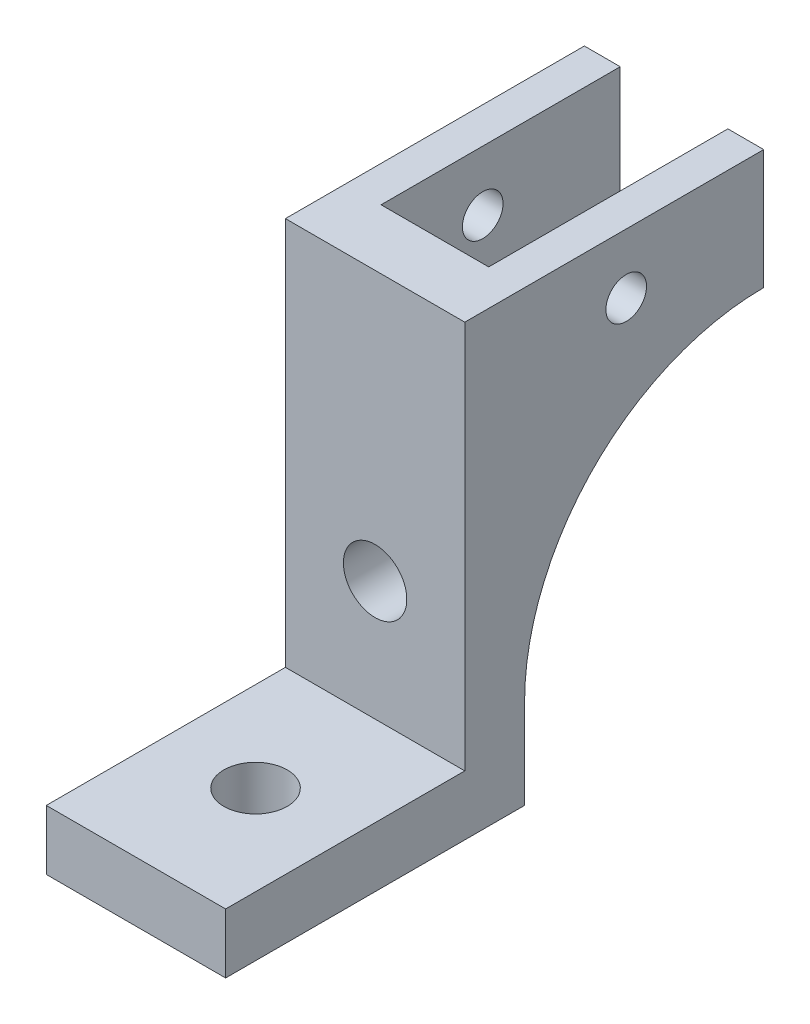
ISO-10303-21;
HEADER;
FILE_DESCRIPTION(('STEP AP214'),'2;1');
FILE_NAME('part.step','',(''),(''),'','','');
FILE_SCHEMA(('AUTOMOTIVE_DESIGN { 1 0 10303 214 1 1 1 1 }'));
ENDSEC;
DATA;
#1=APPLICATION_CONTEXT('core data for automotive mechanical design processes');
#2=APPLICATION_PROTOCOL_DEFINITION('international standard','automotive_design',2000,#1);
#3=PRODUCT_CONTEXT('',#1,'mechanical');
#4=PRODUCT('Part','Part','',(#3));
#5=PRODUCT_RELATED_PRODUCT_CATEGORY('part','',(#4));
#6=PRODUCT_DEFINITION_FORMATION('','',#4);
#7=PRODUCT_DEFINITION_CONTEXT('part definition',#1,'design');
#8=PRODUCT_DEFINITION('design','',#6,#7);
#9=PRODUCT_DEFINITION_SHAPE('','',#8);
#10=(LENGTH_UNIT() NAMED_UNIT(*) SI_UNIT(.MILLI.,.METRE.));
#11=(NAMED_UNIT(*) PLANE_ANGLE_UNIT() SI_UNIT($,.RADIAN.));
#12=(NAMED_UNIT(*) SI_UNIT($,.STERADIAN.) SOLID_ANGLE_UNIT());
#13=UNCERTAINTY_MEASURE_WITH_UNIT(LENGTH_MEASURE(1.E-05),#10,'distance_accuracy_value','');
#14=(GEOMETRIC_REPRESENTATION_CONTEXT(3) GLOBAL_UNCERTAINTY_ASSIGNED_CONTEXT((#13)) GLOBAL_UNIT_ASSIGNED_CONTEXT((#10,
#11,#12)) REPRESENTATION_CONTEXT('',''));
#15=CARTESIAN_POINT('',(0.,0.,0.));
#16=DIRECTION('',(0.,0.,1.));
#17=DIRECTION('',(1.,0.,0.));
#18=AXIS2_PLACEMENT_3D('',#15,#16,#17);
#19=CARTESIAN_POINT('',(0.,0.,0.));
#20=DIRECTION('',(0.,0.,-1.));
#21=DIRECTION('',(-1.,0.,0.));
#22=AXIS2_PLACEMENT_3D('',#19,#20,#21);
#23=PLANE('',#22);
#24=CARTESIAN_POINT('',(7.5,15.,0.));
#25=DIRECTION('',(0.,0.,-1.));
#26=DIRECTION('',(-1.,0.,0.));
#27=AXIS2_PLACEMENT_3D('',#24,#25,#26);
#28=CIRCLE('',#27,2.65);
#29=CARTESIAN_POINT('',(4.85,15.,0.));
#30=VERTEX_POINT('',#29);
#31=EDGE_CURVE('E283',#30,#30,#28,.T.);
#32=ORIENTED_EDGE('',*,*,#31,.F.);
#33=EDGE_LOOP('',(#32));
#34=FACE_BOUND('',#33,.T.);
#35=DIRECTION('',(0.,-1.,0.));
#36=VECTOR('',#35,1.);
#37=CARTESIAN_POINT('',(0.,0.,0.));
#38=LINE('',#37,#36);
#39=CARTESIAN_POINT('',(0.,7.5,0.));
#40=VERTEX_POINT('',#39);
#41=CARTESIAN_POINT('',(0.,0.,0.));
#42=VERTEX_POINT('',#41);
#43=EDGE_CURVE('E218',#40,#42,#38,.T.);
#44=ORIENTED_EDGE('',*,*,#43,.F.);
#45=DIRECTION('',(-1.,0.,0.));
#46=VECTOR('',#45,1.);
#47=CARTESIAN_POINT('',(0.,7.5,0.));
#48=LINE('',#47,#46);
#49=CARTESIAN_POINT('',(2.99999999999999,7.5,0.));
#50=VERTEX_POINT('',#49);
#51=EDGE_CURVE('E257',#40,#50,#48,.F.);
#52=ORIENTED_EDGE('',*,*,#51,.T.);
#53=DIRECTION('',(0.,-1.,0.));
#54=VECTOR('',#53,1.);
#55=CARTESIAN_POINT('',(2.99999999999999,37.5,0.));
#56=LINE('',#55,#54);
#57=CARTESIAN_POINT('',(2.99999999999999,37.5,0.));
#58=VERTEX_POINT('',#57);
#59=EDGE_CURVE('E56',#58,#50,#56,.T.);
#60=ORIENTED_EDGE('',*,*,#59,.F.);
#61=DIRECTION('',(-1.,0.,0.));
#62=VECTOR('',#61,1.);
#63=CARTESIAN_POINT('',(0.,37.5,0.));
#64=LINE('',#63,#62);
#65=CARTESIAN_POINT('',(12.,37.5,0.));
#66=VERTEX_POINT('',#65);
#67=EDGE_CURVE('E222',#66,#58,#64,.T.);
#68=ORIENTED_EDGE('',*,*,#67,.F.);
#69=DIRECTION('',(0.,1.,0.));
#70=VECTOR('',#69,1.);
#71=CARTESIAN_POINT('',(12.,37.5,0.));
#72=LINE('',#71,#70);
#73=CARTESIAN_POINT('',(12.,7.5,0.));
#74=VERTEX_POINT('',#73);
#75=EDGE_CURVE('E64',#74,#66,#72,.T.);
#76=ORIENTED_EDGE('',*,*,#75,.F.);
#77=DIRECTION('',(-1.,0.,0.));
#78=VECTOR('',#77,1.);
#79=CARTESIAN_POINT('',(0.,7.5,0.));
#80=LINE('',#79,#78);
#81=CARTESIAN_POINT('',(15.,7.5,0.));
#82=VERTEX_POINT('',#81);
#83=EDGE_CURVE('E248',#74,#82,#80,.F.);
#84=ORIENTED_EDGE('',*,*,#83,.T.);
#85=DIRECTION('',(0.,1.,0.));
#86=VECTOR('',#85,1.);
#87=CARTESIAN_POINT('',(15.,0.,0.));
#88=LINE('',#87,#86);
#89=CARTESIAN_POINT('',(15.,0.,0.));
#90=VERTEX_POINT('',#89);
#91=EDGE_CURVE('E232',#90,#82,#88,.T.);
#92=ORIENTED_EDGE('',*,*,#91,.F.);
#93=DIRECTION('',(1.,0.,0.));
#94=VECTOR('',#93,1.);
#95=CARTESIAN_POINT('',(0.,0.,0.));
#96=LINE('',#95,#94);
#97=EDGE_CURVE('E229',#42,#90,#96,.T.);
#98=ORIENTED_EDGE('',*,*,#97,.F.);
#99=EDGE_LOOP('',(#44,#52,#60,#68,#76,#84,#92,#98));
#100=FACE_BOUND('',#99,.T.);
#101=ADVANCED_FACE('F38',(#34,#100),#23,.T.);
#102=CARTESIAN_POINT('',(0.,0.,5.));
#103=DIRECTION('',(0.,0.,-1.));
#104=DIRECTION('',(-1.,0.,0.));
#105=AXIS2_PLACEMENT_3D('',#102,#103,#104);
#106=PLANE('',#105);
#107=CARTESIAN_POINT('',(7.5,15.,5.));
#108=DIRECTION('',(0.,0.,-1.));
#109=DIRECTION('',(-1.,0.,0.));
#110=AXIS2_PLACEMENT_3D('',#107,#108,#109);
#111=CIRCLE('',#110,2.65);
#112=CARTESIAN_POINT('',(4.85,15.,5.));
#113=VERTEX_POINT('',#112);
#114=EDGE_CURVE('E42',#113,#113,#111,.T.);
#115=ORIENTED_EDGE('',*,*,#114,.T.);
#116=EDGE_LOOP('',(#115));
#117=FACE_BOUND('',#116,.T.);
#118=DIRECTION('',(-1.,0.,0.));
#119=VECTOR('',#118,1.);
#120=CARTESIAN_POINT('',(0.,5.,5.));
#121=LINE('',#120,#119);
#122=CARTESIAN_POINT('',(15.,5.,5.));
#123=VERTEX_POINT('',#122);
#124=CARTESIAN_POINT('',(0.,5.,5.));
#125=VERTEX_POINT('',#124);
#126=EDGE_CURVE('E193',#123,#125,#121,.T.);
#127=ORIENTED_EDGE('',*,*,#126,.F.);
#128=DIRECTION('',(0.,1.,0.));
#129=VECTOR('',#128,1.);
#130=CARTESIAN_POINT('',(15.,0.,5.));
#131=LINE('',#130,#129);
#132=CARTESIAN_POINT('',(15.,37.5,5.));
#133=VERTEX_POINT('',#132);
#134=EDGE_CURVE('E221',#123,#133,#131,.T.);
#135=ORIENTED_EDGE('',*,*,#134,.T.);
#136=DIRECTION('',(-1.,0.,0.));
#137=VECTOR('',#136,1.);
#138=CARTESIAN_POINT('',(0.,37.5,5.));
#139=LINE('',#138,#137);
#140=CARTESIAN_POINT('',(0.,37.5,5.));
#141=VERTEX_POINT('',#140);
#142=EDGE_CURVE('E141',#133,#141,#139,.T.);
#143=ORIENTED_EDGE('',*,*,#142,.T.);
#144=DIRECTION('',(0.,-1.,0.));
#145=VECTOR('',#144,1.);
#146=CARTESIAN_POINT('',(0.,0.,5.));
#147=LINE('',#146,#145);
#148=EDGE_CURVE('E136',#141,#125,#147,.T.);
#149=ORIENTED_EDGE('',*,*,#148,.T.);
#150=EDGE_LOOP('',(#127,#135,#143,#149));
#151=FACE_BOUND('',#150,.T.);
#152=ADVANCED_FACE('F311',(#117,#151),#106,.F.);
#153=CARTESIAN_POINT('',(0.,0.,5.));
#154=DIRECTION('',(1.,0.,0.));
#155=DIRECTION('',(0.,1.,0.));
#156=AXIS2_PLACEMENT_3D('',#153,#154,#155);
#157=PLANE('',#156);
#158=CARTESIAN_POINT('',(0.,32.5000000000029,-8.49999999999806));
#159=DIRECTION('',(1.,0.,0.));
#160=DIRECTION('',(0.,1.,0.));
#161=AXIS2_PLACEMENT_3D('',#158,#159,#160);
#162=CIRCLE('',#161,1.7);
#163=CARTESIAN_POINT('',(0.,34.2000000000029,-8.49999999999806));
#164=VERTEX_POINT('',#163);
#165=EDGE_CURVE('E254',#164,#164,#162,.T.);
#166=ORIENTED_EDGE('',*,*,#165,.T.);
#167=EDGE_LOOP('',(#166));
#168=FACE_BOUND('',#167,.T.);
#169=DIRECTION('',(0.,0.,-1.));
#170=VECTOR('',#169,1.);
#171=CARTESIAN_POINT('',(0.,37.5,5.));
#172=LINE('',#171,#170);
#173=CARTESIAN_POINT('',(0.,37.5,-20.));
#174=VERTEX_POINT('',#173);
#175=EDGE_CURVE('E130',#141,#174,#172,.T.);
#176=ORIENTED_EDGE('',*,*,#175,.T.);
#177=DIRECTION('',(0.,1.,0.));
#178=VECTOR('',#177,1.);
#179=CARTESIAN_POINT('',(0.,37.5,-20.));
#180=LINE('',#179,#178);
#181=CARTESIAN_POINT('',(0.,27.5,-20.));
#182=VERTEX_POINT('',#181);
#183=EDGE_CURVE('E134',#182,#174,#180,.T.);
#184=ORIENTED_EDGE('',*,*,#183,.F.);
#185=CARTESIAN_POINT('',(0.,7.5,-20.));
#186=DIRECTION('',(1.,0.,0.));
#187=DIRECTION('',(0.,1.,0.));
#188=AXIS2_PLACEMENT_3D('',#185,#186,#187);
#189=CIRCLE('',#188,20.);
#190=EDGE_CURVE('E260',#182,#40,#189,.T.);
#191=ORIENTED_EDGE('',*,*,#190,.T.);
#192=ORIENTED_EDGE('',*,*,#43,.T.);
#193=DIRECTION('',(0.,0.,-1.));
#194=VECTOR('',#193,1.);
#195=CARTESIAN_POINT('',(0.,0.,5.));
#196=LINE('',#195,#194);
#197=CARTESIAN_POINT('',(0.,0.,25.));
#198=VERTEX_POINT('',#197);
#199=EDGE_CURVE('E244',#198,#42,#196,.T.);
#200=ORIENTED_EDGE('',*,*,#199,.F.);
#201=DIRECTION('',(0.,-1.,0.));
#202=VECTOR('',#201,1.);
#203=CARTESIAN_POINT('',(0.,0.,25.));
#204=LINE('',#203,#202);
#205=CARTESIAN_POINT('',(0.,5.,25.));
#206=VERTEX_POINT('',#205);
#207=EDGE_CURVE('E194',#206,#198,#204,.T.);
#208=ORIENTED_EDGE('',*,*,#207,.F.);
#209=DIRECTION('',(0.,0.,-1.));
#210=VECTOR('',#209,1.);
#211=CARTESIAN_POINT('',(0.,5.,25.));
#212=LINE('',#211,#210);
#213=EDGE_CURVE('E208',#206,#125,#212,.T.);
#214=ORIENTED_EDGE('',*,*,#213,.T.);
#215=ORIENTED_EDGE('',*,*,#148,.F.);
#216=EDGE_LOOP('',(#176,#184,#191,#192,#200,#208,#214,#215));
#217=FACE_BOUND('',#216,.T.);
#218=ADVANCED_FACE('F132',(#168,#217),#157,.F.);
#219=CARTESIAN_POINT('',(0.,0.,5.));
#220=DIRECTION('',(0.,1.,0.));
#221=DIRECTION('',(0.,0.,1.));
#222=AXIS2_PLACEMENT_3D('',#219,#220,#221);
#223=PLANE('',#222);
#224=CARTESIAN_POINT('',(7.5,0.,15.));
#225=DIRECTION('',(0.,-1.,0.));
#226=DIRECTION('',(0.,0.,-1.));
#227=AXIS2_PLACEMENT_3D('',#224,#225,#226);
#228=CIRCLE('',#227,2.65);
#229=CARTESIAN_POINT('',(7.5,0.,12.35));
#230=VERTEX_POINT('',#229);
#231=EDGE_CURVE('E270',#230,#230,#228,.T.);
#232=ORIENTED_EDGE('',*,*,#231,.F.);
#233=EDGE_LOOP('',(#232));
#234=FACE_BOUND('',#233,.T.);
#235=ORIENTED_EDGE('',*,*,#97,.T.);
#236=DIRECTION('',(0.,0.,-1.));
#237=VECTOR('',#236,1.);
#238=CARTESIAN_POINT('',(15.,0.,5.));
#239=LINE('',#238,#237);
#240=CARTESIAN_POINT('',(15.,0.,25.));
#241=VERTEX_POINT('',#240);
#242=EDGE_CURVE('E240',#241,#90,#239,.T.);
#243=ORIENTED_EDGE('',*,*,#242,.F.);
#244=DIRECTION('',(1.,0.,0.));
#245=VECTOR('',#244,1.);
#246=CARTESIAN_POINT('',(0.,0.,25.));
#247=LINE('',#246,#245);
#248=EDGE_CURVE('E198',#198,#241,#247,.T.);
#249=ORIENTED_EDGE('',*,*,#248,.F.);
#250=ORIENTED_EDGE('',*,*,#199,.T.);
#251=EDGE_LOOP('',(#235,#243,#249,#250));
#252=FACE_BOUND('',#251,.T.);
#253=ADVANCED_FACE('F328',(#234,#252),#223,.F.);
#254=CARTESIAN_POINT('',(15.,0.,5.));
#255=DIRECTION('',(-1.,0.,0.));
#256=DIRECTION('',(0.,-1.,0.));
#257=AXIS2_PLACEMENT_3D('',#254,#255,#256);
#258=PLANE('',#257);
#259=CARTESIAN_POINT('',(15.,32.5000000000029,-8.49999999999806));
#260=DIRECTION('',(-1.,0.,0.));
#261=DIRECTION('',(0.,-1.,0.));
#262=AXIS2_PLACEMENT_3D('',#259,#260,#261);
#263=CIRCLE('',#262,1.7);
#264=CARTESIAN_POINT('',(15.,30.8000000000029,-8.49999999999806));
#265=VERTEX_POINT('',#264);
#266=EDGE_CURVE('E161',#265,#265,#263,.T.);
#267=ORIENTED_EDGE('',*,*,#266,.T.);
#268=EDGE_LOOP('',(#267));
#269=FACE_BOUND('',#268,.T.);
#270=ORIENTED_EDGE('',*,*,#91,.T.);
#271=CARTESIAN_POINT('',(15.,7.5,-20.));
#272=DIRECTION('',(-1.,0.,0.));
#273=DIRECTION('',(0.,-1.,0.));
#274=AXIS2_PLACEMENT_3D('',#271,#272,#273);
#275=CIRCLE('',#274,20.);
#276=CARTESIAN_POINT('',(15.,27.5,-20.));
#277=VERTEX_POINT('',#276);
#278=EDGE_CURVE('E11',#82,#277,#275,.T.);
#279=ORIENTED_EDGE('',*,*,#278,.T.);
#280=DIRECTION('',(0.,-1.,0.));
#281=VECTOR('',#280,1.);
#282=CARTESIAN_POINT('',(15.,37.5,-20.));
#283=LINE('',#282,#281);
#284=CARTESIAN_POINT('',(15.,37.5,-20.));
#285=VERTEX_POINT('',#284);
#286=EDGE_CURVE('E172',#285,#277,#283,.T.);
#287=ORIENTED_EDGE('',*,*,#286,.F.);
#288=DIRECTION('',(0.,0.,-1.));
#289=VECTOR('',#288,1.);
#290=CARTESIAN_POINT('',(15.,37.5,5.));
#291=LINE('',#290,#289);
#292=EDGE_CURVE('E140',#133,#285,#291,.T.);
#293=ORIENTED_EDGE('',*,*,#292,.F.);
#294=ORIENTED_EDGE('',*,*,#134,.F.);
#295=DIRECTION('',(0.,0.,-1.));
#296=VECTOR('',#295,1.);
#297=CARTESIAN_POINT('',(15.,5.,25.));
#298=LINE('',#297,#296);
#299=CARTESIAN_POINT('',(15.,5.,25.));
#300=VERTEX_POINT('',#299);
#301=EDGE_CURVE('E214',#300,#123,#298,.T.);
#302=ORIENTED_EDGE('',*,*,#301,.F.);
#303=DIRECTION('',(0.,1.,0.));
#304=VECTOR('',#303,1.);
#305=CARTESIAN_POINT('',(15.,0.,25.));
#306=LINE('',#305,#304);
#307=EDGE_CURVE('E202',#241,#300,#306,.T.);
#308=ORIENTED_EDGE('',*,*,#307,.F.);
#309=ORIENTED_EDGE('',*,*,#242,.T.);
#310=EDGE_LOOP('',(#270,#279,#287,#293,#294,#302,#308,#309));
#311=FACE_BOUND('',#310,.T.);
#312=ADVANCED_FACE('F293',(#269,#311),#258,.F.);
#313=CARTESIAN_POINT('',(0.,37.5,5.));
#314=DIRECTION('',(0.,-1.,0.));
#315=DIRECTION('',(0.,0.,-1.));
#316=AXIS2_PLACEMENT_3D('',#313,#314,#315);
#317=PLANE('',#316);
#318=ORIENTED_EDGE('',*,*,#292,.T.);
#319=DIRECTION('',(1.,0.,0.));
#320=VECTOR('',#319,1.);
#321=CARTESIAN_POINT('',(15.,37.5,-20.));
#322=LINE('',#321,#320);
#323=CARTESIAN_POINT('',(12.,37.5,-20.));
#324=VERTEX_POINT('',#323);
#325=EDGE_CURVE('E183',#324,#285,#322,.T.);
#326=ORIENTED_EDGE('',*,*,#325,.F.);
#327=DIRECTION('',(0.,0.,1.));
#328=VECTOR('',#327,1.);
#329=CARTESIAN_POINT('',(12.,37.5,-20.));
#330=LINE('',#329,#328);
#331=EDGE_CURVE('E187',#324,#66,#330,.T.);
#332=ORIENTED_EDGE('',*,*,#331,.T.);
#333=ORIENTED_EDGE('',*,*,#67,.T.);
#334=DIRECTION('',(0.,0.,1.));
#335=VECTOR('',#334,1.);
#336=CARTESIAN_POINT('',(2.99999999999999,37.5,-20.));
#337=LINE('',#336,#335);
#338=CARTESIAN_POINT('',(2.99999999999999,37.5,-20.));
#339=VERTEX_POINT('',#338);
#340=EDGE_CURVE('E147',#339,#58,#337,.T.);
#341=ORIENTED_EDGE('',*,*,#340,.F.);
#342=DIRECTION('',(1.,0.,0.));
#343=VECTOR('',#342,1.);
#344=CARTESIAN_POINT('',(0.,37.5,-20.));
#345=LINE('',#344,#343);
#346=EDGE_CURVE('E144',#174,#339,#345,.T.);
#347=ORIENTED_EDGE('',*,*,#346,.F.);
#348=ORIENTED_EDGE('',*,*,#175,.F.);
#349=ORIENTED_EDGE('',*,*,#142,.F.);
#350=EDGE_LOOP('',(#318,#326,#332,#333,#341,#347,#348,#349));
#351=FACE_BOUND('',#350,.T.);
#352=ADVANCED_FACE('F145',(#351),#317,.F.);
#353=CARTESIAN_POINT('',(0.,5.,25.));
#354=DIRECTION('',(0.,-1.,0.));
#355=DIRECTION('',(0.,0.,-1.));
#356=AXIS2_PLACEMENT_3D('',#353,#354,#355);
#357=PLANE('',#356);
#358=CARTESIAN_POINT('',(7.5,5.,15.));
#359=DIRECTION('',(0.,-1.,0.));
#360=DIRECTION('',(0.,0.,-1.));
#361=AXIS2_PLACEMENT_3D('',#358,#359,#360);
#362=CIRCLE('',#361,2.65);
#363=CARTESIAN_POINT('',(7.5,5.,12.35));
#364=VERTEX_POINT('',#363);
#365=EDGE_CURVE('E267',#364,#364,#362,.T.);
#366=ORIENTED_EDGE('',*,*,#365,.T.);
#367=EDGE_LOOP('',(#366));
#368=FACE_BOUND('',#367,.T.);
#369=ORIENTED_EDGE('',*,*,#126,.T.);
#370=ORIENTED_EDGE('',*,*,#213,.F.);
#371=DIRECTION('',(-1.,0.,0.));
#372=VECTOR('',#371,1.);
#373=CARTESIAN_POINT('',(0.,5.,25.));
#374=LINE('',#373,#372);
#375=EDGE_CURVE('E205',#300,#206,#374,.T.);
#376=ORIENTED_EDGE('',*,*,#375,.F.);
#377=ORIENTED_EDGE('',*,*,#301,.T.);
#378=EDGE_LOOP('',(#369,#370,#376,#377));
#379=FACE_BOUND('',#378,.T.);
#380=ADVANCED_FACE('F325',(#368,#379),#357,.F.);
#381=CARTESIAN_POINT('',(0.,0.,25.));
#382=DIRECTION('',(0.,0.,-1.));
#383=DIRECTION('',(-1.,0.,0.));
#384=AXIS2_PLACEMENT_3D('',#381,#382,#383);
#385=PLANE('',#384);
#386=ORIENTED_EDGE('',*,*,#207,.T.);
#387=ORIENTED_EDGE('',*,*,#248,.T.);
#388=ORIENTED_EDGE('',*,*,#307,.T.);
#389=ORIENTED_EDGE('',*,*,#375,.T.);
#390=EDGE_LOOP('',(#386,#387,#388,#389));
#391=FACE_BOUND('',#390,.T.);
#392=ADVANCED_FACE('F354',(#391),#385,.F.);
#393=CARTESIAN_POINT('',(12.,37.5,-20.));
#394=DIRECTION('',(1.,0.,0.));
#395=DIRECTION('',(0.,1.,0.));
#396=AXIS2_PLACEMENT_3D('',#393,#394,#395);
#397=PLANE('',#396);
#398=CARTESIAN_POINT('',(12.,32.5000000000029,-8.49999999999806));
#399=DIRECTION('',(1.,0.,0.));
#400=DIRECTION('',(0.,1.,0.));
#401=AXIS2_PLACEMENT_3D('',#398,#399,#400);
#402=CIRCLE('',#401,1.7);
#403=CARTESIAN_POINT('',(12.,34.2000000000029,-8.49999999999806));
#404=VERTEX_POINT('',#403);
#405=EDGE_CURVE('E253',#404,#404,#402,.T.);
#406=ORIENTED_EDGE('',*,*,#405,.T.);
#407=EDGE_LOOP('',(#406));
#408=FACE_BOUND('',#407,.T.);
#409=ORIENTED_EDGE('',*,*,#75,.T.);
#410=ORIENTED_EDGE('',*,*,#331,.F.);
#411=DIRECTION('',(0.,1.,0.));
#412=VECTOR('',#411,1.);
#413=CARTESIAN_POINT('',(12.,37.5,-20.));
#414=LINE('',#413,#412);
#415=CARTESIAN_POINT('',(12.,27.5,-20.));
#416=VERTEX_POINT('',#415);
#417=EDGE_CURVE('E180',#416,#324,#414,.T.);
#418=ORIENTED_EDGE('',*,*,#417,.F.);
#419=CARTESIAN_POINT('',(12.,7.5,-20.));
#420=DIRECTION('',(1.,0.,0.));
#421=DIRECTION('',(0.,1.,0.));
#422=AXIS2_PLACEMENT_3D('',#419,#420,#421);
#423=CIRCLE('',#422,20.);
#424=EDGE_CURVE('E48',#416,#74,#423,.T.);
#425=ORIENTED_EDGE('',*,*,#424,.T.);
#426=EDGE_LOOP('',(#409,#410,#418,#425));
#427=FACE_BOUND('',#426,.T.);
#428=ADVANCED_FACE('F348',(#408,#427),#397,.F.);
#429=CARTESIAN_POINT('',(0.,0.,-20.));
#430=DIRECTION('',(0.,0.,-1.));
#431=DIRECTION('',(-1.,0.,0.));
#432=AXIS2_PLACEMENT_3D('',#429,#430,#431);
#433=PLANE('',#432);
#434=ORIENTED_EDGE('',*,*,#286,.T.);
#435=DIRECTION('',(-1.,0.,0.));
#436=VECTOR('',#435,1.);
#437=CARTESIAN_POINT('',(15.,27.5,-20.));
#438=LINE('',#437,#436);
#439=EDGE_CURVE('E176',#277,#416,#438,.T.);
#440=ORIENTED_EDGE('',*,*,#439,.T.);
#441=ORIENTED_EDGE('',*,*,#417,.T.);
#442=ORIENTED_EDGE('',*,*,#325,.T.);
#443=EDGE_LOOP('',(#434,#440,#441,#442));
#444=FACE_BOUND('',#443,.T.);
#445=ADVANCED_FACE('F342',(#444),#433,.T.);
#446=CARTESIAN_POINT('',(2.99999999999999,37.5,-20.));
#447=DIRECTION('',(-1.,0.,0.));
#448=DIRECTION('',(0.,-1.,0.));
#449=AXIS2_PLACEMENT_3D('',#446,#447,#448);
#450=PLANE('',#449);
#451=CARTESIAN_POINT('',(2.99999999999999,32.5000000000029,-8.49999999999806));
#452=DIRECTION('',(-1.,0.,0.));
#453=DIRECTION('',(0.,-1.,0.));
#454=AXIS2_PLACEMENT_3D('',#451,#452,#453);
#455=CIRCLE('',#454,1.7);
#456=CARTESIAN_POINT('',(2.99999999999999,30.8000000000029,-8.49999999999806));
#457=VERTEX_POINT('',#456);
#458=EDGE_CURVE('E249',#457,#457,#455,.T.);
#459=ORIENTED_EDGE('',*,*,#458,.T.);
#460=EDGE_LOOP('',(#459));
#461=FACE_BOUND('',#460,.T.);
#462=ORIENTED_EDGE('',*,*,#59,.T.);
#463=CARTESIAN_POINT('',(2.99999999999999,7.5,-20.));
#464=DIRECTION('',(-1.,0.,0.));
#465=DIRECTION('',(0.,-1.,0.));
#466=AXIS2_PLACEMENT_3D('',#463,#464,#465);
#467=CIRCLE('',#466,20.);
#468=CARTESIAN_POINT('',(2.99999999999999,27.5,-20.));
#469=VERTEX_POINT('',#468);
#470=EDGE_CURVE('E263',#50,#469,#467,.T.);
#471=ORIENTED_EDGE('',*,*,#470,.T.);
#472=DIRECTION('',(0.,-1.,0.));
#473=VECTOR('',#472,1.);
#474=CARTESIAN_POINT('',(2.99999999999999,37.5,-20.));
#475=LINE('',#474,#473);
#476=EDGE_CURVE('E152',#339,#469,#475,.T.);
#477=ORIENTED_EDGE('',*,*,#476,.F.);
#478=ORIENTED_EDGE('',*,*,#340,.T.);
#479=EDGE_LOOP('',(#462,#471,#477,#478));
#480=FACE_BOUND('',#479,.T.);
#481=ADVANCED_FACE('F340',(#461,#480),#450,.F.);
#482=CARTESIAN_POINT('',(0.,0.,-20.));
#483=DIRECTION('',(0.,0.,1.));
#484=DIRECTION('',(1.,0.,0.));
#485=AXIS2_PLACEMENT_3D('',#482,#483,#484);
#486=PLANE('',#485);
#487=ORIENTED_EDGE('',*,*,#183,.T.);
#488=ORIENTED_EDGE('',*,*,#346,.T.);
#489=ORIENTED_EDGE('',*,*,#476,.T.);
#490=DIRECTION('',(-1.,0.,0.));
#491=VECTOR('',#490,1.);
#492=CARTESIAN_POINT('',(0.,27.5,-20.));
#493=LINE('',#492,#491);
#494=EDGE_CURVE('E157',#469,#182,#493,.T.);
#495=ORIENTED_EDGE('',*,*,#494,.T.);
#496=EDGE_LOOP('',(#487,#488,#489,#495));
#497=FACE_BOUND('',#496,.T.);
#498=ADVANCED_FACE('F155',(#497),#486,.F.);
#499=CARTESIAN_POINT('',(0.,32.5000000000029,-8.49999999999806));
#500=DIRECTION('',(1.,0.,0.));
#501=DIRECTION('',(0.,1.,0.));
#502=AXIS2_PLACEMENT_3D('',#499,#500,#501);
#503=CYLINDRICAL_SURFACE('',#502,1.7);
#504=ORIENTED_EDGE('',*,*,#165,.F.);
#505=EDGE_LOOP('',(#504));
#506=FACE_BOUND('',#505,.T.);
#507=ORIENTED_EDGE('',*,*,#458,.F.);
#508=EDGE_LOOP('',(#507));
#509=FACE_BOUND('',#508,.T.);
#510=ADVANCED_FACE('F299',(#506,#509),#503,.F.);
#511=ORIENTED_EDGE('',*,*,#405,.F.);
#512=EDGE_LOOP('',(#511));
#513=FACE_BOUND('',#512,.T.);
#514=ORIENTED_EDGE('',*,*,#266,.F.);
#515=EDGE_LOOP('',(#514));
#516=FACE_BOUND('',#515,.T.);
#517=ADVANCED_FACE('F296',(#513,#516),#503,.F.);
#518=CARTESIAN_POINT('',(0.,7.5,-20.));
#519=DIRECTION('',(-1.,0.,0.));
#520=DIRECTION('',(0.,0.,1.));
#521=AXIS2_PLACEMENT_3D('',#518,#519,#520);
#522=CYLINDRICAL_SURFACE('',#521,20.);
#523=ORIENTED_EDGE('',*,*,#470,.F.);
#524=ORIENTED_EDGE('',*,*,#51,.F.);
#525=ORIENTED_EDGE('',*,*,#190,.F.);
#526=ORIENTED_EDGE('',*,*,#494,.F.);
#527=EDGE_LOOP('',(#523,#524,#525,#526));
#528=FACE_BOUND('',#527,.T.);
#529=ADVANCED_FACE('F298',(#528),#522,.F.);
#530=CARTESIAN_POINT('',(15.,7.5,-20.));
#531=DIRECTION('',(-1.,0.,0.));
#532=DIRECTION('',(0.,0.,1.));
#533=AXIS2_PLACEMENT_3D('',#530,#531,#532);
#534=CYLINDRICAL_SURFACE('',#533,20.);
#535=ORIENTED_EDGE('',*,*,#278,.F.);
#536=ORIENTED_EDGE('',*,*,#83,.F.);
#537=ORIENTED_EDGE('',*,*,#424,.F.);
#538=ORIENTED_EDGE('',*,*,#439,.F.);
#539=EDGE_LOOP('',(#535,#536,#537,#538));
#540=FACE_BOUND('',#539,.T.);
#541=ADVANCED_FACE('F40',(#540),#534,.F.);
#542=CARTESIAN_POINT('',(7.5,10.,15.));
#543=DIRECTION('',(0.,-1.,0.));
#544=DIRECTION('',(0.,0.,-1.));
#545=AXIS2_PLACEMENT_3D('',#542,#543,#544);
#546=CYLINDRICAL_SURFACE('',#545,2.65);
#547=ORIENTED_EDGE('',*,*,#231,.T.);
#548=EDGE_LOOP('',(#547));
#549=FACE_BOUND('',#548,.T.);
#550=ORIENTED_EDGE('',*,*,#365,.F.);
#551=EDGE_LOOP('',(#550));
#552=FACE_BOUND('',#551,.T.);
#553=ADVANCED_FACE('F386',(#549,#552),#546,.F.);
#554=CARTESIAN_POINT('',(7.5,15.,10.));
#555=DIRECTION('',(0.,0.,-1.));
#556=DIRECTION('',(-1.,0.,0.));
#557=AXIS2_PLACEMENT_3D('',#554,#555,#556);
#558=CYLINDRICAL_SURFACE('',#557,2.65);
#559=ORIENTED_EDGE('',*,*,#31,.T.);
#560=EDGE_LOOP('',(#559));
#561=FACE_BOUND('',#560,.T.);
#562=ORIENTED_EDGE('',*,*,#114,.F.);
#563=EDGE_LOOP('',(#562));
#564=FACE_BOUND('',#563,.T.);
#565=ADVANCED_FACE('F390',(#561,#564),#558,.F.);
#566=CLOSED_SHELL('',(#101,#152,#218,#253,#312,#352,#380,#392,#428,#445,#481,#498,#510,#517,
#529,#541,#553,#565));
#567=MANIFOLD_SOLID_BREP('B2',#566);
#568=ADVANCED_BREP_SHAPE_REPRESENTATION('',(#18,#567),#14);
#569=SHAPE_DEFINITION_REPRESENTATION(#9,#568);
ENDSEC;
END-ISO-10303-21;
